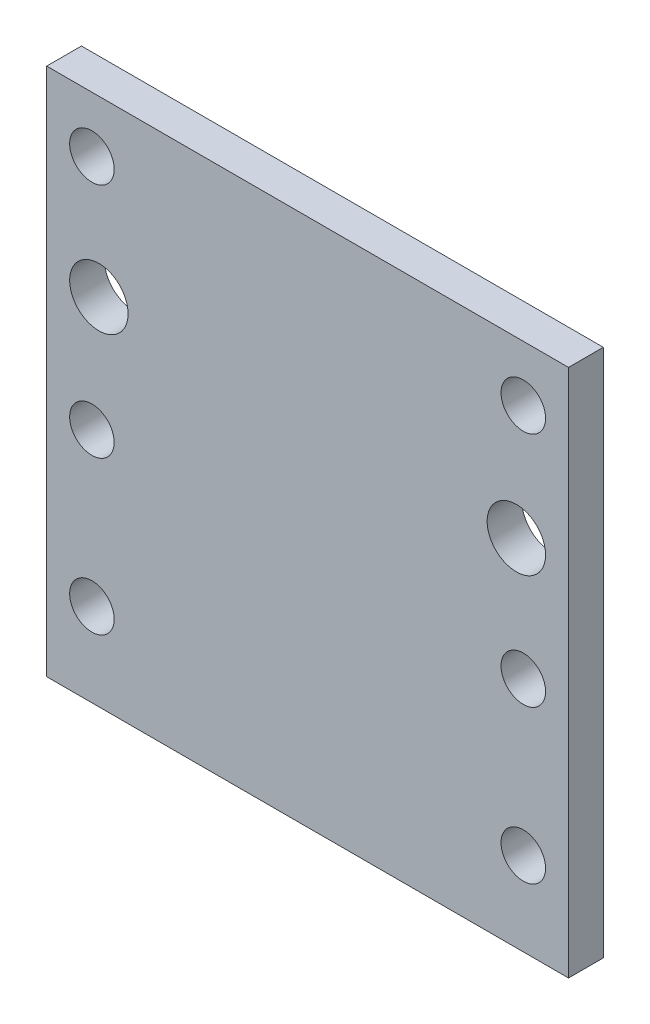
ISO-10303-21;
HEADER;
FILE_DESCRIPTION(('STEP AP214'),'2;1');
FILE_NAME('part.step','',(''),(''),'','','');
FILE_SCHEMA(('AUTOMOTIVE_DESIGN { 1 0 10303 214 1 1 1 1 }'));
ENDSEC;
DATA;
#1=APPLICATION_CONTEXT('core data for automotive mechanical design processes');
#2=APPLICATION_PROTOCOL_DEFINITION('international standard','automotive_design',2000,#1);
#3=PRODUCT_CONTEXT('',#1,'mechanical');
#4=PRODUCT('Part','Part','',(#3));
#5=PRODUCT_RELATED_PRODUCT_CATEGORY('part','',(#4));
#6=PRODUCT_DEFINITION_FORMATION('','',#4);
#7=PRODUCT_DEFINITION_CONTEXT('part definition',#1,'design');
#8=PRODUCT_DEFINITION('design','',#6,#7);
#9=PRODUCT_DEFINITION_SHAPE('','',#8);
#10=(LENGTH_UNIT() NAMED_UNIT(*) SI_UNIT(.MILLI.,.METRE.));
#11=(NAMED_UNIT(*) PLANE_ANGLE_UNIT() SI_UNIT($,.RADIAN.));
#12=(NAMED_UNIT(*) SI_UNIT($,.STERADIAN.) SOLID_ANGLE_UNIT());
#13=UNCERTAINTY_MEASURE_WITH_UNIT(LENGTH_MEASURE(1.E-05),#10,'distance_accuracy_value','');
#14=(GEOMETRIC_REPRESENTATION_CONTEXT(3) GLOBAL_UNCERTAINTY_ASSIGNED_CONTEXT((#13)) GLOBAL_UNIT_ASSIGNED_CONTEXT((#10,
#11,#12)) REPRESENTATION_CONTEXT('',''));
#15=CARTESIAN_POINT('',(0.,0.,0.));
#16=DIRECTION('',(0.,0.,1.));
#17=DIRECTION('',(1.,0.,0.));
#18=AXIS2_PLACEMENT_3D('',#15,#16,#17);
#19=CARTESIAN_POINT('',(67.5,51.,5.));
#20=DIRECTION('',(0.,0.,-1.));
#21=DIRECTION('',(-1.,0.,0.));
#22=AXIS2_PLACEMENT_3D('',#19,#20,#21);
#23=CYLINDRICAL_SURFACE('',#22,4.2);
#24=CARTESIAN_POINT('',(67.5,51.,0.));
#25=DIRECTION('',(0.,0.,1.));
#26=DIRECTION('',(1.,0.,0.));
#27=AXIS2_PLACEMENT_3D('',#24,#25,#26);
#28=CIRCLE('',#27,4.2);
#29=CARTESIAN_POINT('',(71.7,51.,0.));
#30=VERTEX_POINT('',#29);
#31=EDGE_CURVE('E162',#30,#30,#28,.T.);
#32=ORIENTED_EDGE('',*,*,#31,.F.);
#33=EDGE_LOOP('',(#32));
#34=FACE_BOUND('',#33,.T.);
#35=CARTESIAN_POINT('',(67.5,51.,5.));
#36=DIRECTION('',(0.,0.,-1.));
#37=DIRECTION('',(-1.,0.,0.));
#38=AXIS2_PLACEMENT_3D('',#35,#36,#37);
#39=CIRCLE('',#38,4.2);
#40=CARTESIAN_POINT('',(63.3,51.,5.));
#41=VERTEX_POINT('',#40);
#42=EDGE_CURVE('E161',#41,#41,#39,.T.);
#43=ORIENTED_EDGE('',*,*,#42,.F.);
#44=EDGE_LOOP('',(#43));
#45=FACE_BOUND('',#44,.T.);
#46=ADVANCED_FACE('F16',(#34,#45),#23,.F.);
#47=CARTESIAN_POINT('',(7.5,51.,5.));
#48=DIRECTION('',(0.,0.,-1.));
#49=DIRECTION('',(-1.,0.,0.));
#50=AXIS2_PLACEMENT_3D('',#47,#48,#49);
#51=CYLINDRICAL_SURFACE('',#50,4.2);
#52=CARTESIAN_POINT('',(7.5,51.,0.));
#53=DIRECTION('',(0.,0.,1.));
#54=DIRECTION('',(1.,0.,0.));
#55=AXIS2_PLACEMENT_3D('',#52,#53,#54);
#56=CIRCLE('',#55,4.2);
#57=CARTESIAN_POINT('',(11.7,51.,0.));
#58=VERTEX_POINT('',#57);
#59=EDGE_CURVE('E165',#58,#58,#56,.T.);
#60=ORIENTED_EDGE('',*,*,#59,.F.);
#61=EDGE_LOOP('',(#60));
#62=FACE_BOUND('',#61,.T.);
#63=CARTESIAN_POINT('',(7.5,51.,5.));
#64=DIRECTION('',(0.,0.,-1.));
#65=DIRECTION('',(-1.,0.,0.));
#66=AXIS2_PLACEMENT_3D('',#63,#64,#65);
#67=CIRCLE('',#66,4.2);
#68=CARTESIAN_POINT('',(3.3,51.,5.));
#69=VERTEX_POINT('',#68);
#70=EDGE_CURVE('E156',#69,#69,#67,.T.);
#71=ORIENTED_EDGE('',*,*,#70,.F.);
#72=EDGE_LOOP('',(#71));
#73=FACE_BOUND('',#72,.T.);
#74=ADVANCED_FACE('F243',(#62,#73),#51,.F.);
#75=CARTESIAN_POINT('',(68.5,68.,5.));
#76=DIRECTION('',(0.,0.,-1.));
#77=DIRECTION('',(-1.,0.,0.));
#78=AXIS2_PLACEMENT_3D('',#75,#76,#77);
#79=CYLINDRICAL_SURFACE('',#78,3.2);
#80=CARTESIAN_POINT('',(68.5,68.,0.));
#81=DIRECTION('',(0.,0.,1.));
#82=DIRECTION('',(1.,0.,0.));
#83=AXIS2_PLACEMENT_3D('',#80,#81,#82);
#84=CIRCLE('',#83,3.2);
#85=CARTESIAN_POINT('',(71.7,68.,0.));
#86=VERTEX_POINT('',#85);
#87=EDGE_CURVE('E180',#86,#86,#84,.T.);
#88=ORIENTED_EDGE('',*,*,#87,.F.);
#89=EDGE_LOOP('',(#88));
#90=FACE_BOUND('',#89,.T.);
#91=CARTESIAN_POINT('',(68.5,68.,5.));
#92=DIRECTION('',(0.,0.,-1.));
#93=DIRECTION('',(-1.,0.,0.));
#94=AXIS2_PLACEMENT_3D('',#91,#92,#93);
#95=CIRCLE('',#94,3.2);
#96=CARTESIAN_POINT('',(65.3,68.,5.));
#97=VERTEX_POINT('',#96);
#98=EDGE_CURVE('E160',#97,#97,#95,.T.);
#99=ORIENTED_EDGE('',*,*,#98,.F.);
#100=EDGE_LOOP('',(#99));
#101=FACE_BOUND('',#100,.T.);
#102=ADVANCED_FACE('F233',(#90,#101),#79,.F.);
#103=CARTESIAN_POINT('',(68.5,34.,5.));
#104=DIRECTION('',(0.,0.,-1.));
#105=DIRECTION('',(-1.,0.,0.));
#106=AXIS2_PLACEMENT_3D('',#103,#104,#105);
#107=CYLINDRICAL_SURFACE('',#106,3.2);
#108=CARTESIAN_POINT('',(68.5,34.,0.));
#109=DIRECTION('',(0.,0.,1.));
#110=DIRECTION('',(1.,0.,0.));
#111=AXIS2_PLACEMENT_3D('',#108,#109,#110);
#112=CIRCLE('',#111,3.2);
#113=CARTESIAN_POINT('',(71.7,34.,0.));
#114=VERTEX_POINT('',#113);
#115=EDGE_CURVE('E20',#114,#114,#112,.T.);
#116=ORIENTED_EDGE('',*,*,#115,.F.);
#117=EDGE_LOOP('',(#116));
#118=FACE_BOUND('',#117,.T.);
#119=CARTESIAN_POINT('',(68.5,34.,5.));
#120=DIRECTION('',(0.,0.,-1.));
#121=DIRECTION('',(-1.,0.,0.));
#122=AXIS2_PLACEMENT_3D('',#119,#120,#121);
#123=CIRCLE('',#122,3.2);
#124=CARTESIAN_POINT('',(65.3,34.,5.));
#125=VERTEX_POINT('',#124);
#126=EDGE_CURVE('E199',#125,#125,#123,.T.);
#127=ORIENTED_EDGE('',*,*,#126,.F.);
#128=EDGE_LOOP('',(#127));
#129=FACE_BOUND('',#128,.T.);
#130=ADVANCED_FACE('F229',(#118,#129),#107,.F.);
#131=CARTESIAN_POINT('',(68.5,12.,5.));
#132=DIRECTION('',(0.,0.,-1.));
#133=DIRECTION('',(-1.,0.,0.));
#134=AXIS2_PLACEMENT_3D('',#131,#132,#133);
#135=CYLINDRICAL_SURFACE('',#134,3.2);
#136=CARTESIAN_POINT('',(68.5,12.,0.));
#137=DIRECTION('',(0.,0.,1.));
#138=DIRECTION('',(1.,0.,0.));
#139=AXIS2_PLACEMENT_3D('',#136,#137,#138);
#140=CIRCLE('',#139,3.2);
#141=CARTESIAN_POINT('',(71.7,12.,0.));
#142=VERTEX_POINT('',#141);
#143=EDGE_CURVE('E175',#142,#142,#140,.T.);
#144=ORIENTED_EDGE('',*,*,#143,.F.);
#145=EDGE_LOOP('',(#144));
#146=FACE_BOUND('',#145,.T.);
#147=CARTESIAN_POINT('',(68.5,12.,5.));
#148=DIRECTION('',(0.,0.,-1.));
#149=DIRECTION('',(-1.,0.,0.));
#150=AXIS2_PLACEMENT_3D('',#147,#148,#149);
#151=CIRCLE('',#150,3.2);
#152=CARTESIAN_POINT('',(65.3,12.,5.));
#153=VERTEX_POINT('',#152);
#154=EDGE_CURVE('E172',#153,#153,#151,.T.);
#155=ORIENTED_EDGE('',*,*,#154,.F.);
#156=EDGE_LOOP('',(#155));
#157=FACE_BOUND('',#156,.T.);
#158=ADVANCED_FACE('F232',(#146,#157),#135,.F.);
#159=CARTESIAN_POINT('',(6.5,68.,5.));
#160=DIRECTION('',(0.,0.,-1.));
#161=DIRECTION('',(-1.,0.,0.));
#162=AXIS2_PLACEMENT_3D('',#159,#160,#161);
#163=CYLINDRICAL_SURFACE('',#162,3.2);
#164=CARTESIAN_POINT('',(6.5,68.,0.));
#165=DIRECTION('',(0.,0.,1.));
#166=DIRECTION('',(1.,0.,0.));
#167=AXIS2_PLACEMENT_3D('',#164,#165,#166);
#168=CIRCLE('',#167,3.2);
#169=CARTESIAN_POINT('',(9.7,68.,0.));
#170=VERTEX_POINT('',#169);
#171=EDGE_CURVE('E178',#170,#170,#168,.T.);
#172=ORIENTED_EDGE('',*,*,#171,.F.);
#173=EDGE_LOOP('',(#172));
#174=FACE_BOUND('',#173,.T.);
#175=CARTESIAN_POINT('',(6.5,68.,5.));
#176=DIRECTION('',(0.,0.,-1.));
#177=DIRECTION('',(-1.,0.,0.));
#178=AXIS2_PLACEMENT_3D('',#175,#176,#177);
#179=CIRCLE('',#178,3.2);
#180=CARTESIAN_POINT('',(3.3,68.,5.));
#181=VERTEX_POINT('',#180);
#182=EDGE_CURVE('E167',#181,#181,#179,.T.);
#183=ORIENTED_EDGE('',*,*,#182,.F.);
#184=EDGE_LOOP('',(#183));
#185=FACE_BOUND('',#184,.T.);
#186=ADVANCED_FACE('F240',(#174,#185),#163,.F.);
#187=CARTESIAN_POINT('',(6.5,34.,5.));
#188=DIRECTION('',(0.,0.,-1.));
#189=DIRECTION('',(-1.,0.,0.));
#190=AXIS2_PLACEMENT_3D('',#187,#188,#189);
#191=CYLINDRICAL_SURFACE('',#190,3.2);
#192=CARTESIAN_POINT('',(6.5,34.,0.));
#193=DIRECTION('',(0.,0.,1.));
#194=DIRECTION('',(1.,0.,0.));
#195=AXIS2_PLACEMENT_3D('',#192,#193,#194);
#196=CIRCLE('',#195,3.2);
#197=CARTESIAN_POINT('',(9.7,34.,0.));
#198=VERTEX_POINT('',#197);
#199=EDGE_CURVE('E27',#198,#198,#196,.T.);
#200=ORIENTED_EDGE('',*,*,#199,.F.);
#201=EDGE_LOOP('',(#200));
#202=FACE_BOUND('',#201,.T.);
#203=CARTESIAN_POINT('',(6.5,34.,5.));
#204=DIRECTION('',(0.,0.,-1.));
#205=DIRECTION('',(-1.,0.,0.));
#206=AXIS2_PLACEMENT_3D('',#203,#204,#205);
#207=CIRCLE('',#206,3.2);
#208=CARTESIAN_POINT('',(3.3,34.,5.));
#209=VERTEX_POINT('',#208);
#210=EDGE_CURVE('E171',#209,#209,#207,.T.);
#211=ORIENTED_EDGE('',*,*,#210,.F.);
#212=EDGE_LOOP('',(#211));
#213=FACE_BOUND('',#212,.T.);
#214=ADVANCED_FACE('F260',(#202,#213),#191,.F.);
#215=CARTESIAN_POINT('',(6.5,12.,5.));
#216=DIRECTION('',(0.,0.,-1.));
#217=DIRECTION('',(-1.,0.,0.));
#218=AXIS2_PLACEMENT_3D('',#215,#216,#217);
#219=CYLINDRICAL_SURFACE('',#218,3.2);
#220=CARTESIAN_POINT('',(6.5,12.,0.));
#221=DIRECTION('',(0.,0.,1.));
#222=DIRECTION('',(1.,0.,0.));
#223=AXIS2_PLACEMENT_3D('',#220,#221,#222);
#224=CIRCLE('',#223,3.2);
#225=CARTESIAN_POINT('',(9.7,12.,0.));
#226=VERTEX_POINT('',#225);
#227=EDGE_CURVE('E11',#226,#226,#224,.T.);
#228=ORIENTED_EDGE('',*,*,#227,.F.);
#229=EDGE_LOOP('',(#228));
#230=FACE_BOUND('',#229,.T.);
#231=CARTESIAN_POINT('',(6.5,12.,5.));
#232=DIRECTION('',(0.,0.,-1.));
#233=DIRECTION('',(-1.,0.,0.));
#234=AXIS2_PLACEMENT_3D('',#231,#232,#233);
#235=CIRCLE('',#234,3.2);
#236=CARTESIAN_POINT('',(3.3,12.,5.));
#237=VERTEX_POINT('',#236);
#238=EDGE_CURVE('E166',#237,#237,#235,.T.);
#239=ORIENTED_EDGE('',*,*,#238,.F.);
#240=EDGE_LOOP('',(#239));
#241=FACE_BOUND('',#240,.T.);
#242=ADVANCED_FACE('F263',(#230,#241),#219,.F.);
#243=CARTESIAN_POINT('',(0.,0.,0.));
#244=DIRECTION('',(0.,0.,1.));
#245=DIRECTION('',(1.,0.,0.));
#246=AXIS2_PLACEMENT_3D('',#243,#244,#245);
#247=PLANE('',#246);
#248=DIRECTION('',(0.,1.,0.));
#249=VECTOR('',#248,1.);
#250=CARTESIAN_POINT('',(75.,0.,0.));
#251=LINE('',#250,#249);
#252=CARTESIAN_POINT('',(75.,0.,0.));
#253=VERTEX_POINT('',#252);
#254=CARTESIAN_POINT('',(75.,76.,0.));
#255=VERTEX_POINT('',#254);
#256=EDGE_CURVE('E125',#253,#255,#251,.T.);
#257=ORIENTED_EDGE('',*,*,#256,.F.);
#258=DIRECTION('',(1.,0.,0.));
#259=VECTOR('',#258,1.);
#260=CARTESIAN_POINT('',(0.,0.,0.));
#261=LINE('',#260,#259);
#262=CARTESIAN_POINT('',(0.,0.,0.));
#263=VERTEX_POINT('',#262);
#264=EDGE_CURVE('E119',#263,#253,#261,.T.);
#265=ORIENTED_EDGE('',*,*,#264,.F.);
#266=DIRECTION('',(0.,-1.,0.));
#267=VECTOR('',#266,1.);
#268=CARTESIAN_POINT('',(0.,76.,0.));
#269=LINE('',#268,#267);
#270=CARTESIAN_POINT('',(0.,76.,0.));
#271=VERTEX_POINT('',#270);
#272=EDGE_CURVE('E122',#271,#263,#269,.T.);
#273=ORIENTED_EDGE('',*,*,#272,.F.);
#274=DIRECTION('',(-1.,0.,0.));
#275=VECTOR('',#274,1.);
#276=CARTESIAN_POINT('',(75.,76.,0.));
#277=LINE('',#276,#275);
#278=EDGE_CURVE('E195',#255,#271,#277,.T.);
#279=ORIENTED_EDGE('',*,*,#278,.F.);
#280=EDGE_LOOP('',(#257,#265,#273,#279));
#281=FACE_BOUND('',#280,.T.);
#282=ORIENTED_EDGE('',*,*,#227,.T.);
#283=EDGE_LOOP('',(#282));
#284=FACE_BOUND('',#283,.T.);
#285=ORIENTED_EDGE('',*,*,#199,.T.);
#286=EDGE_LOOP('',(#285));
#287=FACE_BOUND('',#286,.T.);
#288=ORIENTED_EDGE('',*,*,#171,.T.);
#289=EDGE_LOOP('',(#288));
#290=FACE_BOUND('',#289,.T.);
#291=ORIENTED_EDGE('',*,*,#143,.T.);
#292=EDGE_LOOP('',(#291));
#293=FACE_BOUND('',#292,.T.);
#294=ORIENTED_EDGE('',*,*,#115,.T.);
#295=EDGE_LOOP('',(#294));
#296=FACE_BOUND('',#295,.T.);
#297=ORIENTED_EDGE('',*,*,#87,.T.);
#298=EDGE_LOOP('',(#297));
#299=FACE_BOUND('',#298,.T.);
#300=ORIENTED_EDGE('',*,*,#59,.T.);
#301=EDGE_LOOP('',(#300));
#302=FACE_BOUND('',#301,.T.);
#303=ORIENTED_EDGE('',*,*,#31,.T.);
#304=EDGE_LOOP('',(#303));
#305=FACE_BOUND('',#304,.T.);
#306=ADVANCED_FACE('F120',(#281,#284,#287,#290,#293,#296,#299,#302,#305),#247,.F.);
#307=CARTESIAN_POINT('',(0.,0.,5.));
#308=DIRECTION('',(0.,0.,1.));
#309=DIRECTION('',(1.,0.,0.));
#310=AXIS2_PLACEMENT_3D('',#307,#308,#309);
#311=PLANE('',#310);
#312=DIRECTION('',(0.,1.,0.));
#313=VECTOR('',#312,1.);
#314=CARTESIAN_POINT('',(75.,0.,5.));
#315=LINE('',#314,#313);
#316=CARTESIAN_POINT('',(75.,0.,5.));
#317=VERTEX_POINT('',#316);
#318=CARTESIAN_POINT('',(75.,76.,5.));
#319=VERTEX_POINT('',#318);
#320=EDGE_CURVE('E151',#317,#319,#315,.T.);
#321=ORIENTED_EDGE('',*,*,#320,.T.);
#322=DIRECTION('',(-1.,0.,0.));
#323=VECTOR('',#322,1.);
#324=CARTESIAN_POINT('',(75.,76.,5.));
#325=LINE('',#324,#323);
#326=CARTESIAN_POINT('',(0.,76.,5.));
#327=VERTEX_POINT('',#326);
#328=EDGE_CURVE('E140',#319,#327,#325,.T.);
#329=ORIENTED_EDGE('',*,*,#328,.T.);
#330=DIRECTION('',(0.,-1.,0.));
#331=VECTOR('',#330,1.);
#332=CARTESIAN_POINT('',(0.,76.,5.));
#333=LINE('',#332,#331);
#334=CARTESIAN_POINT('',(0.,0.,5.));
#335=VERTEX_POINT('',#334);
#336=EDGE_CURVE('E128',#327,#335,#333,.T.);
#337=ORIENTED_EDGE('',*,*,#336,.T.);
#338=DIRECTION('',(1.,0.,0.));
#339=VECTOR('',#338,1.);
#340=CARTESIAN_POINT('',(0.,0.,5.));
#341=LINE('',#340,#339);
#342=EDGE_CURVE('E109',#335,#317,#341,.T.);
#343=ORIENTED_EDGE('',*,*,#342,.T.);
#344=EDGE_LOOP('',(#321,#329,#337,#343));
#345=FACE_BOUND('',#344,.T.);
#346=ORIENTED_EDGE('',*,*,#238,.T.);
#347=EDGE_LOOP('',(#346));
#348=FACE_BOUND('',#347,.T.);
#349=ORIENTED_EDGE('',*,*,#210,.T.);
#350=EDGE_LOOP('',(#349));
#351=FACE_BOUND('',#350,.T.);
#352=ORIENTED_EDGE('',*,*,#182,.T.);
#353=EDGE_LOOP('',(#352));
#354=FACE_BOUND('',#353,.T.);
#355=ORIENTED_EDGE('',*,*,#154,.T.);
#356=EDGE_LOOP('',(#355));
#357=FACE_BOUND('',#356,.T.);
#358=ORIENTED_EDGE('',*,*,#126,.T.);
#359=EDGE_LOOP('',(#358));
#360=FACE_BOUND('',#359,.T.);
#361=ORIENTED_EDGE('',*,*,#98,.T.);
#362=EDGE_LOOP('',(#361));
#363=FACE_BOUND('',#362,.T.);
#364=ORIENTED_EDGE('',*,*,#70,.T.);
#365=EDGE_LOOP('',(#364));
#366=FACE_BOUND('',#365,.T.);
#367=ORIENTED_EDGE('',*,*,#42,.T.);
#368=EDGE_LOOP('',(#367));
#369=FACE_BOUND('',#368,.T.);
#370=ADVANCED_FACE('F269',(#345,#348,#351,#354,#357,#360,#363,#366,#369),#311,.T.);
#371=CARTESIAN_POINT('',(0.,0.,5.));
#372=DIRECTION('',(0.,1.,0.));
#373=DIRECTION('',(1.,0.,0.));
#374=AXIS2_PLACEMENT_3D('',#371,#372,#373);
#375=PLANE('',#374);
#376=ORIENTED_EDGE('',*,*,#264,.T.);
#377=DIRECTION('',(0.,0.,-1.));
#378=VECTOR('',#377,1.);
#379=CARTESIAN_POINT('',(75.,0.,5.));
#380=LINE('',#379,#378);
#381=EDGE_CURVE('E154',#317,#253,#380,.T.);
#382=ORIENTED_EDGE('',*,*,#381,.F.);
#383=ORIENTED_EDGE('',*,*,#342,.F.);
#384=DIRECTION('',(0.,0.,-1.));
#385=VECTOR('',#384,1.);
#386=CARTESIAN_POINT('',(0.,0.,5.));
#387=LINE('',#386,#385);
#388=EDGE_CURVE('E131',#335,#263,#387,.T.);
#389=ORIENTED_EDGE('',*,*,#388,.T.);
#390=EDGE_LOOP('',(#376,#382,#383,#389));
#391=FACE_BOUND('',#390,.T.);
#392=ADVANCED_FACE('F18',(#391),#375,.F.);
#393=CARTESIAN_POINT('',(0.,76.,5.));
#394=DIRECTION('',(1.,0.,0.));
#395=DIRECTION('',(0.,1.,0.));
#396=AXIS2_PLACEMENT_3D('',#393,#394,#395);
#397=PLANE('',#396);
#398=ORIENTED_EDGE('',*,*,#272,.T.);
#399=ORIENTED_EDGE('',*,*,#388,.F.);
#400=ORIENTED_EDGE('',*,*,#336,.F.);
#401=DIRECTION('',(0.,0.,-1.));
#402=VECTOR('',#401,1.);
#403=CARTESIAN_POINT('',(0.,76.,5.));
#404=LINE('',#403,#402);
#405=EDGE_CURVE('E137',#327,#271,#404,.T.);
#406=ORIENTED_EDGE('',*,*,#405,.T.);
#407=EDGE_LOOP('',(#398,#399,#400,#406));
#408=FACE_BOUND('',#407,.T.);
#409=ADVANCED_FACE('F135',(#408),#397,.F.);
#410=CARTESIAN_POINT('',(75.,76.,5.));
#411=DIRECTION('',(0.,-1.,0.));
#412=DIRECTION('',(0.,0.,-1.));
#413=AXIS2_PLACEMENT_3D('',#410,#411,#412);
#414=PLANE('',#413);
#415=ORIENTED_EDGE('',*,*,#278,.T.);
#416=ORIENTED_EDGE('',*,*,#405,.F.);
#417=ORIENTED_EDGE('',*,*,#328,.F.);
#418=DIRECTION('',(0.,0.,-1.));
#419=VECTOR('',#418,1.);
#420=CARTESIAN_POINT('',(75.,76.,5.));
#421=LINE('',#420,#419);
#422=EDGE_CURVE('E155',#319,#255,#421,.T.);
#423=ORIENTED_EDGE('',*,*,#422,.T.);
#424=EDGE_LOOP('',(#415,#416,#417,#423));
#425=FACE_BOUND('',#424,.T.);
#426=ADVANCED_FACE('F268',(#425),#414,.F.);
#427=CARTESIAN_POINT('',(75.,0.,5.));
#428=DIRECTION('',(-1.,0.,0.));
#429=DIRECTION('',(0.,0.,1.));
#430=AXIS2_PLACEMENT_3D('',#427,#428,#429);
#431=PLANE('',#430);
#432=ORIENTED_EDGE('',*,*,#256,.T.);
#433=ORIENTED_EDGE('',*,*,#422,.F.);
#434=ORIENTED_EDGE('',*,*,#320,.F.);
#435=ORIENTED_EDGE('',*,*,#381,.T.);
#436=EDGE_LOOP('',(#432,#433,#434,#435));
#437=FACE_BOUND('',#436,.T.);
#438=ADVANCED_FACE('F265',(#437),#431,.F.);
#439=CLOSED_SHELL('',(#46,#74,#102,#130,#158,#186,#214,#242,#306,#370,#392,#409,#426,#438));
#440=MANIFOLD_SOLID_BREP('B1',#439);
#441=ADVANCED_BREP_SHAPE_REPRESENTATION('',(#18,#440),#14);
#442=SHAPE_DEFINITION_REPRESENTATION(#9,#441);
ENDSEC;
END-ISO-10303-21;
